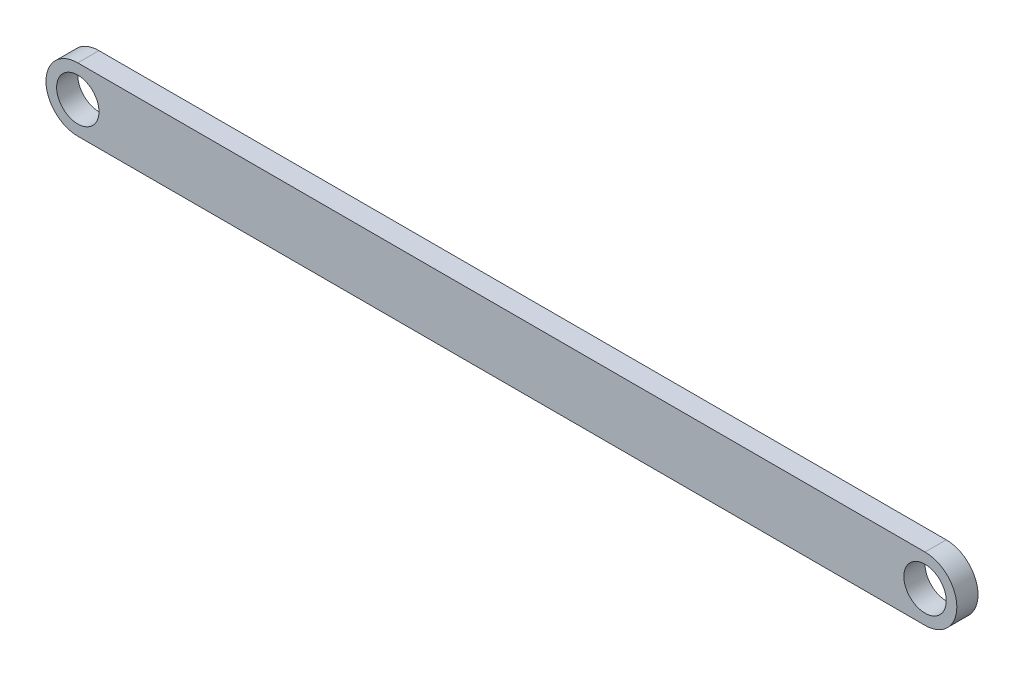
ISO-10303-21;
HEADER;
FILE_DESCRIPTION(('STEP AP214'),'2;1');
FILE_NAME('part.step','',(''),(''),'','','');
FILE_SCHEMA(('AUTOMOTIVE_DESIGN { 1 0 10303 214 1 1 1 1 }'));
ENDSEC;
DATA;
#1=APPLICATION_CONTEXT('core data for automotive mechanical design processes');
#2=APPLICATION_PROTOCOL_DEFINITION('international standard','automotive_design',2000,#1);
#3=PRODUCT_CONTEXT('',#1,'mechanical');
#4=PRODUCT('Part','Part','',(#3));
#5=PRODUCT_RELATED_PRODUCT_CATEGORY('part','',(#4));
#6=PRODUCT_DEFINITION_FORMATION('','',#4);
#7=PRODUCT_DEFINITION_CONTEXT('part definition',#1,'design');
#8=PRODUCT_DEFINITION('design','',#6,#7);
#9=PRODUCT_DEFINITION_SHAPE('','',#8);
#10=(LENGTH_UNIT() NAMED_UNIT(*) SI_UNIT(.MILLI.,.METRE.));
#11=(NAMED_UNIT(*) PLANE_ANGLE_UNIT() SI_UNIT($,.RADIAN.));
#12=(NAMED_UNIT(*) SI_UNIT($,.STERADIAN.) SOLID_ANGLE_UNIT());
#13=UNCERTAINTY_MEASURE_WITH_UNIT(LENGTH_MEASURE(1.E-05),#10,'distance_accuracy_value','');
#14=(GEOMETRIC_REPRESENTATION_CONTEXT(3) GLOBAL_UNCERTAINTY_ASSIGNED_CONTEXT((#13)) GLOBAL_UNIT_ASSIGNED_CONTEXT((#10,
#11,#12)) REPRESENTATION_CONTEXT('',''));
#15=CARTESIAN_POINT('',(0.,0.,0.));
#16=DIRECTION('',(0.,0.,1.));
#17=DIRECTION('',(1.,0.,0.));
#18=AXIS2_PLACEMENT_3D('',#15,#16,#17);
#19=CARTESIAN_POINT('',(-192.931392931393,0.,10.));
#20=DIRECTION('',(0.,0.,1.));
#21=DIRECTION('',(1.,0.,0.));
#22=AXIS2_PLACEMENT_3D('',#19,#20,#21);
#23=PLANE('',#22);
#24=CARTESIAN_POINT('',(-192.931392931393,0.,10.));
#25=DIRECTION('',(0.,0.,1.));
#26=DIRECTION('',(1.,0.,0.));
#27=AXIS2_PLACEMENT_3D('',#24,#25,#26);
#28=CIRCLE('',#27,10.);
#29=CARTESIAN_POINT('',(-182.931392931393,0.,10.));
#30=VERTEX_POINT('',#29);
#31=EDGE_CURVE('E116',#30,#30,#28,.T.);
#32=ORIENTED_EDGE('',*,*,#31,.F.);
#33=EDGE_LOOP('',(#32));
#34=FACE_BOUND('',#33,.T.);
#35=CARTESIAN_POINT('',(-192.931392931393,0.,10.));
#36=DIRECTION('',(0.,0.,1.));
#37=DIRECTION('',(1.,0.,0.));
#38=AXIS2_PLACEMENT_3D('',#35,#36,#37);
#39=CIRCLE('',#38,15.);
#40=CARTESIAN_POINT('',(-192.931392931393,15.,10.));
#41=VERTEX_POINT('',#40);
#42=CARTESIAN_POINT('',(-192.931392931393,-15.,10.));
#43=VERTEX_POINT('',#42);
#44=EDGE_CURVE('E96',#41,#43,#39,.T.);
#45=ORIENTED_EDGE('',*,*,#44,.T.);
#46=DIRECTION('',(1.,0.,0.));
#47=VECTOR('',#46,1.);
#48=CARTESIAN_POINT('',(-192.931392931393,-15.,10.));
#49=LINE('',#48,#47);
#50=CARTESIAN_POINT('',(207.068607068607,-15.,10.));
#51=VERTEX_POINT('',#50);
#52=EDGE_CURVE('E91',#43,#51,#49,.T.);
#53=ORIENTED_EDGE('',*,*,#52,.T.);
#54=CARTESIAN_POINT('',(207.068607068607,0.,10.));
#55=DIRECTION('',(0.,0.,1.));
#56=DIRECTION('',(1.,0.,0.));
#57=AXIS2_PLACEMENT_3D('',#54,#55,#56);
#58=CIRCLE('',#57,15.);
#59=CARTESIAN_POINT('',(207.068607068607,15.,10.));
#60=VERTEX_POINT('',#59);
#61=EDGE_CURVE('E94',#51,#60,#58,.T.);
#62=ORIENTED_EDGE('',*,*,#61,.T.);
#63=DIRECTION('',(-1.,0.,0.));
#64=VECTOR('',#63,1.);
#65=CARTESIAN_POINT('',(-192.931392931393,15.,10.));
#66=LINE('',#65,#64);
#67=EDGE_CURVE('E61',#60,#41,#66,.T.);
#68=ORIENTED_EDGE('',*,*,#67,.T.);
#69=EDGE_LOOP('',(#45,#53,#62,#68));
#70=FACE_BOUND('',#69,.T.);
#71=CARTESIAN_POINT('',(207.068607068607,0.,10.));
#72=DIRECTION('',(0.,0.,1.));
#73=DIRECTION('',(1.,0.,0.));
#74=AXIS2_PLACEMENT_3D('',#71,#72,#73);
#75=CIRCLE('',#74,10.);
#76=CARTESIAN_POINT('',(217.068607068607,0.,10.));
#77=VERTEX_POINT('',#76);
#78=EDGE_CURVE('E138',#77,#77,#75,.T.);
#79=ORIENTED_EDGE('',*,*,#78,.F.);
#80=EDGE_LOOP('',(#79));
#81=FACE_BOUND('',#80,.T.);
#82=ADVANCED_FACE('F43',(#34,#70,#81),#23,.T.);
#83=CARTESIAN_POINT('',(-192.931392931393,0.,0.));
#84=DIRECTION('',(0.,0.,1.));
#85=DIRECTION('',(1.,0.,0.));
#86=AXIS2_PLACEMENT_3D('',#83,#84,#85);
#87=PLANE('',#86);
#88=CARTESIAN_POINT('',(-192.931392931393,0.,0.));
#89=DIRECTION('',(0.,0.,1.));
#90=DIRECTION('',(1.,0.,0.));
#91=AXIS2_PLACEMENT_3D('',#88,#89,#90);
#92=CIRCLE('',#91,15.);
#93=CARTESIAN_POINT('',(-192.931392931393,15.,0.));
#94=VERTEX_POINT('',#93);
#95=CARTESIAN_POINT('',(-192.931392931393,-15.,0.));
#96=VERTEX_POINT('',#95);
#97=EDGE_CURVE('E112',#94,#96,#92,.T.);
#98=ORIENTED_EDGE('',*,*,#97,.F.);
#99=DIRECTION('',(-1.,0.,0.));
#100=VECTOR('',#99,1.);
#101=CARTESIAN_POINT('',(-192.931392931393,15.,0.));
#102=LINE('',#101,#100);
#103=CARTESIAN_POINT('',(207.068607068607,15.,0.));
#104=VERTEX_POINT('',#103);
#105=EDGE_CURVE('E84',#104,#94,#102,.T.);
#106=ORIENTED_EDGE('',*,*,#105,.F.);
#107=CARTESIAN_POINT('',(207.068607068607,0.,0.));
#108=DIRECTION('',(0.,0.,1.));
#109=DIRECTION('',(1.,0.,0.));
#110=AXIS2_PLACEMENT_3D('',#107,#108,#109);
#111=CIRCLE('',#110,15.);
#112=CARTESIAN_POINT('',(207.068607068607,-15.,0.));
#113=VERTEX_POINT('',#112);
#114=EDGE_CURVE('E78',#113,#104,#111,.T.);
#115=ORIENTED_EDGE('',*,*,#114,.F.);
#116=DIRECTION('',(1.,0.,0.));
#117=VECTOR('',#116,1.);
#118=CARTESIAN_POINT('',(-192.931392931393,-15.,0.));
#119=LINE('',#118,#117);
#120=EDGE_CURVE('E101',#96,#113,#119,.T.);
#121=ORIENTED_EDGE('',*,*,#120,.F.);
#122=EDGE_LOOP('',(#98,#106,#115,#121));
#123=FACE_BOUND('',#122,.T.);
#124=CARTESIAN_POINT('',(-192.931392931393,0.,0.));
#125=DIRECTION('',(0.,0.,1.));
#126=DIRECTION('',(1.,0.,0.));
#127=AXIS2_PLACEMENT_3D('',#124,#125,#126);
#128=CIRCLE('',#127,10.);
#129=CARTESIAN_POINT('',(-182.931392931393,0.,0.));
#130=VERTEX_POINT('',#129);
#131=EDGE_CURVE('E134',#130,#130,#128,.T.);
#132=ORIENTED_EDGE('',*,*,#131,.T.);
#133=EDGE_LOOP('',(#132));
#134=FACE_BOUND('',#133,.T.);
#135=CARTESIAN_POINT('',(207.068607068607,0.,0.));
#136=DIRECTION('',(0.,0.,1.));
#137=DIRECTION('',(1.,0.,0.));
#138=AXIS2_PLACEMENT_3D('',#135,#136,#137);
#139=CIRCLE('',#138,10.);
#140=CARTESIAN_POINT('',(217.068607068607,0.,0.));
#141=VERTEX_POINT('',#140);
#142=EDGE_CURVE('E142',#141,#141,#139,.T.);
#143=ORIENTED_EDGE('',*,*,#142,.T.);
#144=EDGE_LOOP('',(#143));
#145=FACE_BOUND('',#144,.T.);
#146=ADVANCED_FACE('F129',(#123,#134,#145),#87,.F.);
#147=CARTESIAN_POINT('',(-192.931392931393,0.,10.));
#148=DIRECTION('',(0.,0.,-1.));
#149=DIRECTION('',(-1.,0.,0.));
#150=AXIS2_PLACEMENT_3D('',#147,#148,#149);
#151=CYLINDRICAL_SURFACE('',#150,15.);
#152=ORIENTED_EDGE('',*,*,#97,.T.);
#153=DIRECTION('',(0.,0.,-1.));
#154=VECTOR('',#153,1.);
#155=CARTESIAN_POINT('',(-192.931392931393,-15.,10.));
#156=LINE('',#155,#154);
#157=EDGE_CURVE('E11',#43,#96,#156,.T.);
#158=ORIENTED_EDGE('',*,*,#157,.F.);
#159=ORIENTED_EDGE('',*,*,#44,.F.);
#160=DIRECTION('',(0.,0.,-1.));
#161=VECTOR('',#160,1.);
#162=CARTESIAN_POINT('',(-192.931392931393,15.,10.));
#163=LINE('',#162,#161);
#164=EDGE_CURVE('E108',#41,#94,#163,.T.);
#165=ORIENTED_EDGE('',*,*,#164,.T.);
#166=EDGE_LOOP('',(#152,#158,#159,#165));
#167=FACE_BOUND('',#166,.T.);
#168=ADVANCED_FACE('F45',(#167),#151,.T.);
#169=CARTESIAN_POINT('',(-192.931392931393,-15.,10.));
#170=DIRECTION('',(0.,1.,0.));
#171=DIRECTION('',(0.,0.,1.));
#172=AXIS2_PLACEMENT_3D('',#169,#170,#171);
#173=PLANE('',#172);
#174=ORIENTED_EDGE('',*,*,#120,.T.);
#175=DIRECTION('',(0.,0.,-1.));
#176=VECTOR('',#175,1.);
#177=CARTESIAN_POINT('',(207.068607068607,-15.,10.));
#178=LINE('',#177,#176);
#179=EDGE_CURVE('E53',#51,#113,#178,.T.);
#180=ORIENTED_EDGE('',*,*,#179,.F.);
#181=ORIENTED_EDGE('',*,*,#52,.F.);
#182=ORIENTED_EDGE('',*,*,#157,.T.);
#183=EDGE_LOOP('',(#174,#180,#181,#182));
#184=FACE_BOUND('',#183,.T.);
#185=ADVANCED_FACE('F100',(#184),#173,.F.);
#186=CARTESIAN_POINT('',(207.068607068607,0.,10.));
#187=DIRECTION('',(0.,0.,-1.));
#188=DIRECTION('',(-1.,0.,0.));
#189=AXIS2_PLACEMENT_3D('',#186,#187,#188);
#190=CYLINDRICAL_SURFACE('',#189,15.);
#191=ORIENTED_EDGE('',*,*,#114,.T.);
#192=DIRECTION('',(0.,0.,-1.));
#193=VECTOR('',#192,1.);
#194=CARTESIAN_POINT('',(207.068607068607,15.,10.));
#195=LINE('',#194,#193);
#196=EDGE_CURVE('E103',#60,#104,#195,.T.);
#197=ORIENTED_EDGE('',*,*,#196,.F.);
#198=ORIENTED_EDGE('',*,*,#61,.F.);
#199=ORIENTED_EDGE('',*,*,#179,.T.);
#200=EDGE_LOOP('',(#191,#197,#198,#199));
#201=FACE_BOUND('',#200,.T.);
#202=ADVANCED_FACE('F104',(#201),#190,.T.);
#203=CARTESIAN_POINT('',(-192.931392931393,15.,10.));
#204=DIRECTION('',(0.,-1.,0.));
#205=DIRECTION('',(0.,0.,-1.));
#206=AXIS2_PLACEMENT_3D('',#203,#204,#205);
#207=PLANE('',#206);
#208=ORIENTED_EDGE('',*,*,#105,.T.);
#209=ORIENTED_EDGE('',*,*,#164,.F.);
#210=ORIENTED_EDGE('',*,*,#67,.F.);
#211=ORIENTED_EDGE('',*,*,#196,.T.);
#212=EDGE_LOOP('',(#208,#209,#210,#211));
#213=FACE_BOUND('',#212,.T.);
#214=ADVANCED_FACE('F126',(#213),#207,.F.);
#215=CARTESIAN_POINT('',(-192.931392931393,0.,10.));
#216=DIRECTION('',(0.,0.,-1.));
#217=DIRECTION('',(-1.,0.,0.));
#218=AXIS2_PLACEMENT_3D('',#215,#216,#217);
#219=CYLINDRICAL_SURFACE('',#218,10.);
#220=ORIENTED_EDGE('',*,*,#31,.T.);
#221=EDGE_LOOP('',(#220));
#222=FACE_BOUND('',#221,.T.);
#223=ORIENTED_EDGE('',*,*,#131,.F.);
#224=EDGE_LOOP('',(#223));
#225=FACE_BOUND('',#224,.T.);
#226=ADVANCED_FACE('F161',(#222,#225),#219,.F.);
#227=CARTESIAN_POINT('',(207.068607068607,0.,10.));
#228=DIRECTION('',(0.,0.,-1.));
#229=DIRECTION('',(-1.,0.,0.));
#230=AXIS2_PLACEMENT_3D('',#227,#228,#229);
#231=CYLINDRICAL_SURFACE('',#230,10.);
#232=ORIENTED_EDGE('',*,*,#78,.T.);
#233=EDGE_LOOP('',(#232));
#234=FACE_BOUND('',#233,.T.);
#235=ORIENTED_EDGE('',*,*,#142,.F.);
#236=EDGE_LOOP('',(#235));
#237=FACE_BOUND('',#236,.T.);
#238=ADVANCED_FACE('F150',(#234,#237),#231,.F.);
#239=CLOSED_SHELL('',(#82,#146,#168,#185,#202,#214,#226,#238));
#240=MANIFOLD_SOLID_BREP('B2',#239);
#241=ADVANCED_BREP_SHAPE_REPRESENTATION('',(#18,#240),#14);
#242=SHAPE_DEFINITION_REPRESENTATION(#9,#241);
ENDSEC;
END-ISO-10303-21;
